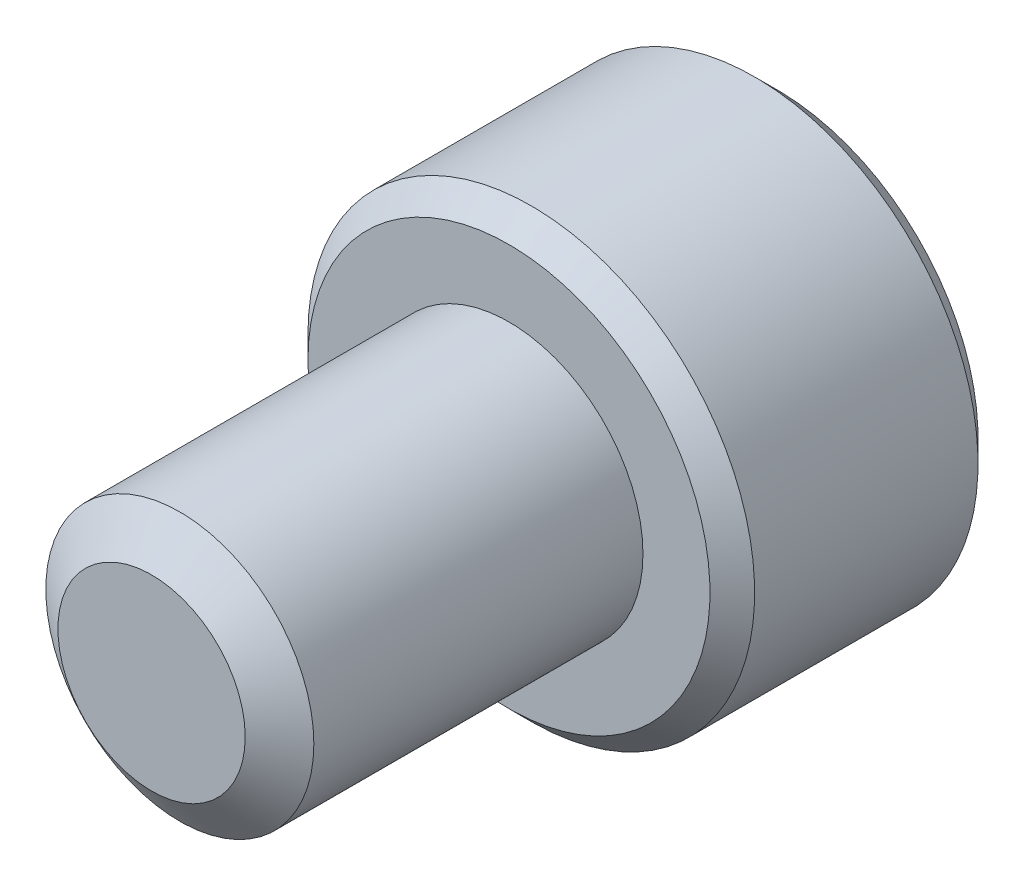
ISO-10303-21;
HEADER;
FILE_DESCRIPTION(('STEP AP214'),'2;1');
FILE_NAME('part.step','',(''),(''),'','','');
FILE_SCHEMA(('AUTOMOTIVE_DESIGN { 1 0 10303 214 1 1 1 1 }'));
ENDSEC;
DATA;
#1=APPLICATION_CONTEXT('core data for automotive mechanical design processes');
#2=APPLICATION_PROTOCOL_DEFINITION('international standard','automotive_design',2000,#1);
#3=PRODUCT_CONTEXT('',#1,'mechanical');
#4=PRODUCT('Part','Part','',(#3));
#5=PRODUCT_RELATED_PRODUCT_CATEGORY('part','',(#4));
#6=PRODUCT_DEFINITION_FORMATION('','',#4);
#7=PRODUCT_DEFINITION_CONTEXT('part definition',#1,'design');
#8=PRODUCT_DEFINITION('design','',#6,#7);
#9=PRODUCT_DEFINITION_SHAPE('','',#8);
#10=(LENGTH_UNIT() NAMED_UNIT(*) SI_UNIT(.MILLI.,.METRE.));
#11=(NAMED_UNIT(*) PLANE_ANGLE_UNIT() SI_UNIT($,.RADIAN.));
#12=(NAMED_UNIT(*) SI_UNIT($,.STERADIAN.) SOLID_ANGLE_UNIT());
#13=UNCERTAINTY_MEASURE_WITH_UNIT(LENGTH_MEASURE(1.E-05),#10,'distance_accuracy_value','');
#14=(GEOMETRIC_REPRESENTATION_CONTEXT(3) GLOBAL_UNCERTAINTY_ASSIGNED_CONTEXT((#13)) GLOBAL_UNIT_ASSIGNED_CONTEXT((#10,
#11,#12)) REPRESENTATION_CONTEXT('',''));
#15=CARTESIAN_POINT('',(0.,0.,0.));
#16=DIRECTION('',(0.,0.,1.));
#17=DIRECTION('',(1.,0.,0.));
#18=AXIS2_PLACEMENT_3D('',#15,#16,#17);
#19=CARTESIAN_POINT('',(0.,0.,-8.));
#20=DIRECTION('',(0.,0.,1.));
#21=DIRECTION('',(1.,0.,0.));
#22=AXIS2_PLACEMENT_3D('',#19,#20,#21);
#23=CYLINDRICAL_SURFACE('',#22,3.);
#24=CARTESIAN_POINT('',(0.,0.,-8.));
#25=DIRECTION('',(0.,0.,-1.));
#26=DIRECTION('',(-1.,0.,0.));
#27=AXIS2_PLACEMENT_3D('',#24,#25,#26);
#28=CIRCLE('',#27,3.);
#29=CARTESIAN_POINT('',(-3.,0.,-8.));
#30=VERTEX_POINT('',#29);
#31=EDGE_CURVE('E154',#30,#30,#28,.F.);
#32=ORIENTED_EDGE('',*,*,#31,.T.);
#33=EDGE_LOOP('',(#32));
#34=FACE_BOUND('',#33,.T.);
#35=CARTESIAN_POINT('',(0.,0.,-0.632650851713494));
#36=DIRECTION('',(0.,0.,1.));
#37=DIRECTION('',(1.,0.,0.));
#38=AXIS2_PLACEMENT_3D('',#35,#36,#37);
#39=CIRCLE('',#38,3.);
#40=CARTESIAN_POINT('',(3.,0.,-0.632650851713494));
#41=VERTEX_POINT('',#40);
#42=EDGE_CURVE('E171',#41,#41,#39,.T.);
#43=ORIENTED_EDGE('',*,*,#42,.F.);
#44=EDGE_LOOP('',(#43));
#45=FACE_BOUND('',#44,.T.);
#46=ADVANCED_FACE('F39',(#34,#45),#23,.T.);
#47=CARTESIAN_POINT('',(0.,0.,0.));
#48=DIRECTION('',(0.,0.,-1.));
#49=DIRECTION('',(-1.,0.,0.));
#50=AXIS2_PLACEMENT_3D('',#47,#48,#49);
#51=CONICAL_SURFACE('',#50,2.09648094716167,0.959931088596884);
#52=ORIENTED_EDGE('',*,*,#42,.T.);
#53=EDGE_LOOP('',(#52));
#54=FACE_BOUND('',#53,.T.);
#55=CARTESIAN_POINT('',(0.,0.,0.));
#56=DIRECTION('',(0.,0.,1.));
#57=DIRECTION('',(1.,0.,0.));
#58=AXIS2_PLACEMENT_3D('',#55,#56,#57);
#59=CIRCLE('',#58,2.09648094716167);
#60=CARTESIAN_POINT('',(2.09648094716167,0.,0.));
#61=VERTEX_POINT('',#60);
#62=EDGE_CURVE('E167',#61,#61,#59,.T.);
#63=ORIENTED_EDGE('',*,*,#62,.F.);
#64=EDGE_LOOP('',(#63));
#65=FACE_BOUND('',#64,.T.);
#66=ADVANCED_FACE('F220',(#54,#65),#51,.T.);
#67=CARTESIAN_POINT('',(0.,0.,0.));
#68=DIRECTION('',(0.,0.,1.));
#69=DIRECTION('',(1.,0.,0.));
#70=AXIS2_PLACEMENT_3D('',#67,#68,#69);
#71=PLANE('',#70);
#72=ORIENTED_EDGE('',*,*,#62,.T.);
#73=EDGE_LOOP('',(#72));
#74=FACE_BOUND('',#73,.T.);
#75=ADVANCED_FACE('F226',(#74),#71,.T.);
#76=CARTESIAN_POINT('',(0.,0.,-14.));
#77=DIRECTION('',(0.,0.,1.));
#78=DIRECTION('',(1.,0.,0.));
#79=AXIS2_PLACEMENT_3D('',#76,#77,#78);
#80=CYLINDRICAL_SURFACE('',#79,5.);
#81=CARTESIAN_POINT('',(0.,0.,-13.5));
#82=DIRECTION('',(0.,0.,-1.));
#83=DIRECTION('',(-1.,0.,0.));
#84=AXIS2_PLACEMENT_3D('',#81,#82,#83);
#85=CIRCLE('',#84,5.);
#86=CARTESIAN_POINT('',(-5.,0.,-13.5));
#87=VERTEX_POINT('',#86);
#88=EDGE_CURVE('E48',#87,#87,#85,.F.);
#89=ORIENTED_EDGE('',*,*,#88,.T.);
#90=EDGE_LOOP('',(#89));
#91=FACE_BOUND('',#90,.T.);
#92=CARTESIAN_POINT('',(0.,0.,-8.5));
#93=DIRECTION('',(0.,0.,-1.));
#94=DIRECTION('',(-1.,0.,0.));
#95=AXIS2_PLACEMENT_3D('',#92,#93,#94);
#96=CIRCLE('',#95,5.);
#97=CARTESIAN_POINT('',(-5.,0.,-8.5));
#98=VERTEX_POINT('',#97);
#99=EDGE_CURVE('E179',#98,#98,#96,.T.);
#100=ORIENTED_EDGE('',*,*,#99,.T.);
#101=EDGE_LOOP('',(#100));
#102=FACE_BOUND('',#101,.T.);
#103=ADVANCED_FACE('F186',(#91,#102),#80,.T.);
#104=CARTESIAN_POINT('',(0.,0.,-14.));
#105=DIRECTION('',(0.,0.,-1.));
#106=DIRECTION('',(-1.,0.,0.));
#107=AXIS2_PLACEMENT_3D('',#104,#105,#106);
#108=PLANE('',#107);
#109=CARTESIAN_POINT('',(0.,0.,-14.));
#110=DIRECTION('',(0.,0.,-1.));
#111=DIRECTION('',(-1.,0.,0.));
#112=AXIS2_PLACEMENT_3D('',#109,#110,#111);
#113=CIRCLE('',#112,4.5);
#114=CARTESIAN_POINT('',(-4.5,0.,-14.));
#115=VERTEX_POINT('',#114);
#116=EDGE_CURVE('E175',#115,#115,#113,.T.);
#117=ORIENTED_EDGE('',*,*,#116,.T.);
#118=EDGE_LOOP('',(#117));
#119=FACE_BOUND('',#118,.T.);
#120=DIRECTION('',(0.866025403784439,0.5,0.));
#121=VECTOR('',#120,1.);
#122=CARTESIAN_POINT('',(-2.5,1.44337567297406,-14.));
#123=LINE('',#122,#121);
#124=CARTESIAN_POINT('',(-2.5,1.44337567297406,-14.));
#125=VERTEX_POINT('',#124);
#126=CARTESIAN_POINT('',(0.,2.88675134594813,-14.));
#127=VERTEX_POINT('',#126);
#128=EDGE_CURVE('E55',#125,#127,#123,.T.);
#129=ORIENTED_EDGE('',*,*,#128,.F.);
#130=DIRECTION('',(0.,1.,0.));
#131=VECTOR('',#130,1.);
#132=CARTESIAN_POINT('',(-2.5,-1.44337567297406,-14.));
#133=LINE('',#132,#131);
#134=CARTESIAN_POINT('',(-2.5,-1.44337567297406,-14.));
#135=VERTEX_POINT('',#134);
#136=EDGE_CURVE('E148',#135,#125,#133,.T.);
#137=ORIENTED_EDGE('',*,*,#136,.F.);
#138=DIRECTION('',(-0.866025403784439,0.5,0.));
#139=VECTOR('',#138,1.);
#140=CARTESIAN_POINT('',(0.,-2.88675134594813,-14.));
#141=LINE('',#140,#139);
#142=CARTESIAN_POINT('',(0.,-2.88675134594813,-14.));
#143=VERTEX_POINT('',#142);
#144=EDGE_CURVE('E145',#143,#135,#141,.T.);
#145=ORIENTED_EDGE('',*,*,#144,.F.);
#146=DIRECTION('',(-0.866025403784439,-0.5,0.));
#147=VECTOR('',#146,1.);
#148=CARTESIAN_POINT('',(2.5,-1.44337567297407,-14.));
#149=LINE('',#148,#147);
#150=CARTESIAN_POINT('',(2.5,-1.44337567297407,-14.));
#151=VERTEX_POINT('',#150);
#152=EDGE_CURVE('E103',#151,#143,#149,.T.);
#153=ORIENTED_EDGE('',*,*,#152,.F.);
#154=DIRECTION('',(0.,-1.,0.));
#155=VECTOR('',#154,1.);
#156=CARTESIAN_POINT('',(2.5,1.44337567297406,-14.));
#157=LINE('',#156,#155);
#158=CARTESIAN_POINT('',(2.5,1.44337567297406,-14.));
#159=VERTEX_POINT('',#158);
#160=EDGE_CURVE('E139',#159,#151,#157,.T.);
#161=ORIENTED_EDGE('',*,*,#160,.F.);
#162=DIRECTION('',(0.866025403784439,-0.5,0.));
#163=VECTOR('',#162,1.);
#164=CARTESIAN_POINT('',(0.,2.88675134594813,-14.));
#165=LINE('',#164,#163);
#166=EDGE_CURVE('E135',#127,#159,#165,.T.);
#167=ORIENTED_EDGE('',*,*,#166,.F.);
#168=EDGE_LOOP('',(#129,#137,#145,#153,#161,#167));
#169=FACE_BOUND('',#168,.T.);
#170=ADVANCED_FACE('F194',(#119,#169),#108,.T.);
#171=CARTESIAN_POINT('',(0.,0.,-8.));
#172=DIRECTION('',(0.,0.,-1.));
#173=DIRECTION('',(-1.,0.,0.));
#174=AXIS2_PLACEMENT_3D('',#171,#172,#173);
#175=PLANE('',#174);
#176=CARTESIAN_POINT('',(0.,0.,-8.));
#177=DIRECTION('',(0.,0.,-1.));
#178=DIRECTION('',(-1.,0.,0.));
#179=AXIS2_PLACEMENT_3D('',#176,#177,#178);
#180=CIRCLE('',#179,4.5);
#181=CARTESIAN_POINT('',(-4.5,0.,-8.));
#182=VERTEX_POINT('',#181);
#183=EDGE_CURVE('E11',#182,#182,#180,.F.);
#184=ORIENTED_EDGE('',*,*,#183,.T.);
#185=EDGE_LOOP('',(#184));
#186=FACE_BOUND('',#185,.T.);
#187=ORIENTED_EDGE('',*,*,#31,.F.);
#188=EDGE_LOOP('',(#187));
#189=FACE_BOUND('',#188,.T.);
#190=ADVANCED_FACE('F197',(#186,#189),#175,.F.);
#191=CARTESIAN_POINT('',(-2.5,1.44337567297406,-10.25));
#192=DIRECTION('',(-0.5,0.866025403784439,0.));
#193=DIRECTION('',(-0.866025403784439,-0.5,0.));
#194=AXIS2_PLACEMENT_3D('',#191,#192,#193);
#195=PLANE('',#194);
#196=ORIENTED_EDGE('',*,*,#128,.T.);
#197=DIRECTION('',(0.,0.,-1.));
#198=VECTOR('',#197,1.);
#199=CARTESIAN_POINT('',(0.,2.88675134594813,-10.25));
#200=LINE('',#199,#198);
#201=CARTESIAN_POINT('',(0.,2.88675134594813,-10.25));
#202=VERTEX_POINT('',#201);
#203=EDGE_CURVE('E85',#202,#127,#200,.T.);
#204=ORIENTED_EDGE('',*,*,#203,.F.);
#205=DIRECTION('',(0.866025403784439,0.5,0.));
#206=VECTOR('',#205,1.);
#207=CARTESIAN_POINT('',(-2.5,1.44337567297406,-10.25));
#208=LINE('',#207,#206);
#209=CARTESIAN_POINT('',(-2.5,1.44337567297406,-10.25));
#210=VERTEX_POINT('',#209);
#211=EDGE_CURVE('E151',#210,#202,#208,.T.);
#212=ORIENTED_EDGE('',*,*,#211,.F.);
#213=DIRECTION('',(0.,0.,-1.));
#214=VECTOR('',#213,1.);
#215=CARTESIAN_POINT('',(-2.5,1.44337567297406,-10.25));
#216=LINE('',#215,#214);
#217=EDGE_CURVE('E63',#210,#125,#216,.T.);
#218=ORIENTED_EDGE('',*,*,#217,.T.);
#219=EDGE_LOOP('',(#196,#204,#212,#218));
#220=FACE_BOUND('',#219,.T.);
#221=ADVANCED_FACE('F207',(#220),#195,.F.);
#222=CARTESIAN_POINT('',(-2.5,-1.44337567297406,-10.25));
#223=DIRECTION('',(-1.,0.,0.));
#224=DIRECTION('',(0.,-1.,0.));
#225=AXIS2_PLACEMENT_3D('',#222,#223,#224);
#226=PLANE('',#225);
#227=ORIENTED_EDGE('',*,*,#136,.T.);
#228=ORIENTED_EDGE('',*,*,#217,.F.);
#229=DIRECTION('',(0.,1.,0.));
#230=VECTOR('',#229,1.);
#231=CARTESIAN_POINT('',(-2.5,-1.44337567297406,-10.25));
#232=LINE('',#231,#230);
#233=CARTESIAN_POINT('',(-2.5,-1.44337567297406,-10.25));
#234=VERTEX_POINT('',#233);
#235=EDGE_CURVE('E117',#234,#210,#232,.T.);
#236=ORIENTED_EDGE('',*,*,#235,.F.);
#237=DIRECTION('',(0.,0.,-1.));
#238=VECTOR('',#237,1.);
#239=CARTESIAN_POINT('',(-2.5,-1.44337567297406,-10.25));
#240=LINE('',#239,#238);
#241=EDGE_CURVE('E108',#234,#135,#240,.T.);
#242=ORIENTED_EDGE('',*,*,#241,.T.);
#243=EDGE_LOOP('',(#227,#228,#236,#242));
#244=FACE_BOUND('',#243,.T.);
#245=ADVANCED_FACE('F209',(#244),#226,.F.);
#246=CARTESIAN_POINT('',(0.,-2.88675134594813,-10.25));
#247=DIRECTION('',(-0.5,-0.866025403784439,0.));
#248=DIRECTION('',(0.866025403784439,-0.5,0.));
#249=AXIS2_PLACEMENT_3D('',#246,#247,#248);
#250=PLANE('',#249);
#251=ORIENTED_EDGE('',*,*,#144,.T.);
#252=ORIENTED_EDGE('',*,*,#241,.F.);
#253=DIRECTION('',(-0.866025403784439,0.5,0.));
#254=VECTOR('',#253,1.);
#255=CARTESIAN_POINT('',(0.,-2.88675134594813,-10.25));
#256=LINE('',#255,#254);
#257=CARTESIAN_POINT('',(0.,-2.88675134594813,-10.25));
#258=VERTEX_POINT('',#257);
#259=EDGE_CURVE('E112',#258,#234,#256,.T.);
#260=ORIENTED_EDGE('',*,*,#259,.F.);
#261=DIRECTION('',(0.,0.,-1.));
#262=VECTOR('',#261,1.);
#263=CARTESIAN_POINT('',(0.,-2.88675134594813,-10.25));
#264=LINE('',#263,#262);
#265=EDGE_CURVE('E96',#258,#143,#264,.T.);
#266=ORIENTED_EDGE('',*,*,#265,.T.);
#267=EDGE_LOOP('',(#251,#252,#260,#266));
#268=FACE_BOUND('',#267,.T.);
#269=ADVANCED_FACE('F113',(#268),#250,.F.);
#270=CARTESIAN_POINT('',(2.5,-1.44337567297407,-10.25));
#271=DIRECTION('',(0.5,-0.866025403784439,0.));
#272=DIRECTION('',(0.866025403784439,0.5,0.));
#273=AXIS2_PLACEMENT_3D('',#270,#271,#272);
#274=PLANE('',#273);
#275=ORIENTED_EDGE('',*,*,#152,.T.);
#276=ORIENTED_EDGE('',*,*,#265,.F.);
#277=DIRECTION('',(-0.866025403784439,-0.5,0.));
#278=VECTOR('',#277,1.);
#279=CARTESIAN_POINT('',(2.5,-1.44337567297407,-10.25));
#280=LINE('',#279,#278);
#281=CARTESIAN_POINT('',(2.5,-1.44337567297407,-10.25));
#282=VERTEX_POINT('',#281);
#283=EDGE_CURVE('E100',#282,#258,#280,.T.);
#284=ORIENTED_EDGE('',*,*,#283,.F.);
#285=DIRECTION('',(0.,0.,-1.));
#286=VECTOR('',#285,1.);
#287=CARTESIAN_POINT('',(2.5,-1.44337567297407,-10.25));
#288=LINE('',#287,#286);
#289=EDGE_CURVE('E109',#282,#151,#288,.T.);
#290=ORIENTED_EDGE('',*,*,#289,.T.);
#291=EDGE_LOOP('',(#275,#276,#284,#290));
#292=FACE_BOUND('',#291,.T.);
#293=ADVANCED_FACE('F98',(#292),#274,.F.);
#294=CARTESIAN_POINT('',(2.5,1.44337567297406,-10.25));
#295=DIRECTION('',(1.,0.,0.));
#296=DIRECTION('',(0.,0.,-1.));
#297=AXIS2_PLACEMENT_3D('',#294,#295,#296);
#298=PLANE('',#297);
#299=ORIENTED_EDGE('',*,*,#160,.T.);
#300=ORIENTED_EDGE('',*,*,#289,.F.);
#301=DIRECTION('',(0.,-1.,0.));
#302=VECTOR('',#301,1.);
#303=CARTESIAN_POINT('',(2.5,1.44337567297406,-10.25));
#304=LINE('',#303,#302);
#305=CARTESIAN_POINT('',(2.5,1.44337567297406,-10.25));
#306=VERTEX_POINT('',#305);
#307=EDGE_CURVE('E123',#306,#282,#304,.T.);
#308=ORIENTED_EDGE('',*,*,#307,.F.);
#309=DIRECTION('',(0.,0.,-1.));
#310=VECTOR('',#309,1.);
#311=CARTESIAN_POINT('',(2.5,1.44337567297406,-10.25));
#312=LINE('',#311,#310);
#313=EDGE_CURVE('E159',#306,#159,#312,.T.);
#314=ORIENTED_EDGE('',*,*,#313,.T.);
#315=EDGE_LOOP('',(#299,#300,#308,#314));
#316=FACE_BOUND('',#315,.T.);
#317=ADVANCED_FACE('F281',(#316),#298,.F.);
#318=CARTESIAN_POINT('',(0.,2.88675134594813,-10.25));
#319=DIRECTION('',(0.5,0.866025403784439,0.));
#320=DIRECTION('',(-0.866025403784439,0.5,0.));
#321=AXIS2_PLACEMENT_3D('',#318,#319,#320);
#322=PLANE('',#321);
#323=ORIENTED_EDGE('',*,*,#166,.T.);
#324=ORIENTED_EDGE('',*,*,#313,.F.);
#325=DIRECTION('',(0.866025403784439,-0.5,0.));
#326=VECTOR('',#325,1.);
#327=CARTESIAN_POINT('',(0.,2.88675134594813,-10.25));
#328=LINE('',#327,#326);
#329=EDGE_CURVE('E127',#202,#306,#328,.T.);
#330=ORIENTED_EDGE('',*,*,#329,.F.);
#331=ORIENTED_EDGE('',*,*,#203,.T.);
#332=EDGE_LOOP('',(#323,#324,#330,#331));
#333=FACE_BOUND('',#332,.T.);
#334=ADVANCED_FACE('F203',(#333),#322,.F.);
#335=CARTESIAN_POINT('',(2.5,4.33012701892219,-10.25));
#336=DIRECTION('',(0.,0.,-1.));
#337=DIRECTION('',(-1.,0.,0.));
#338=AXIS2_PLACEMENT_3D('',#335,#336,#337);
#339=PLANE('',#338);
#340=ORIENTED_EDGE('',*,*,#211,.T.);
#341=ORIENTED_EDGE('',*,*,#329,.T.);
#342=ORIENTED_EDGE('',*,*,#307,.T.);
#343=ORIENTED_EDGE('',*,*,#283,.T.);
#344=ORIENTED_EDGE('',*,*,#259,.T.);
#345=ORIENTED_EDGE('',*,*,#235,.T.);
#346=EDGE_LOOP('',(#340,#341,#342,#343,#344,#345));
#347=FACE_BOUND('',#346,.T.);
#348=ADVANCED_FACE('F120',(#347),#339,.T.);
#349=CARTESIAN_POINT('',(0.,0.,-14.));
#350=DIRECTION('',(0.,0.,1.));
#351=DIRECTION('',(1.,0.,0.));
#352=AXIS2_PLACEMENT_3D('',#349,#350,#351);
#353=CONICAL_SURFACE('',#352,4.5,0.785398163397447);
#354=ORIENTED_EDGE('',*,*,#88,.F.);
#355=EDGE_LOOP('',(#354));
#356=FACE_BOUND('',#355,.T.);
#357=ORIENTED_EDGE('',*,*,#116,.F.);
#358=EDGE_LOOP('',(#357));
#359=FACE_BOUND('',#358,.T.);
#360=ADVANCED_FACE('F189',(#356,#359),#353,.T.);
#361=CARTESIAN_POINT('',(0.,0.,-8.5));
#362=DIRECTION('',(0.,0.,-1.));
#363=DIRECTION('',(-1.,0.,0.));
#364=AXIS2_PLACEMENT_3D('',#361,#362,#363);
#365=CONICAL_SURFACE('',#364,5.,0.785398163397451);
#366=ORIENTED_EDGE('',*,*,#183,.F.);
#367=EDGE_LOOP('',(#366));
#368=FACE_BOUND('',#367,.T.);
#369=ORIENTED_EDGE('',*,*,#99,.F.);
#370=EDGE_LOOP('',(#369));
#371=FACE_BOUND('',#370,.T.);
#372=ADVANCED_FACE('F41',(#368,#371),#365,.T.);
#373=CLOSED_SHELL('',(#46,#66,#75,#103,#170,#190,#221,#245,#269,#293,#317,#334,#348,#360,#372));
#374=MANIFOLD_SOLID_BREP('B2',#373);
#375=ADVANCED_BREP_SHAPE_REPRESENTATION('',(#18,#374),#14);
#376=SHAPE_DEFINITION_REPRESENTATION(#9,#375);
ENDSEC;
END-ISO-10303-21;
